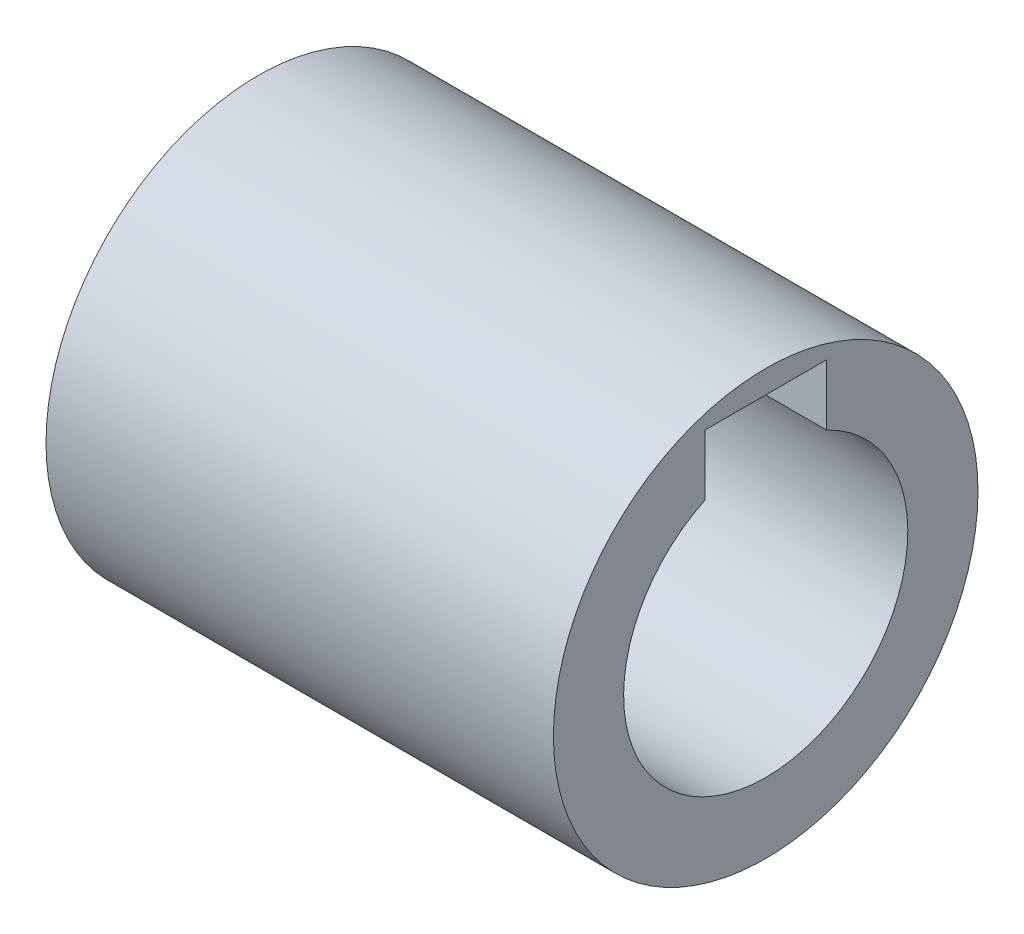
ISO-10303-21;
HEADER;
FILE_DESCRIPTION(('STEP AP214'),'2;1');
FILE_NAME('part.step','',(''),(''),'','','');
FILE_SCHEMA(('AUTOMOTIVE_DESIGN { 1 0 10303 214 1 1 1 1 }'));
ENDSEC;
DATA;
#1=APPLICATION_CONTEXT('core data for automotive mechanical design processes');
#2=APPLICATION_PROTOCOL_DEFINITION('international standard','automotive_design',2000,#1);
#3=PRODUCT_CONTEXT('',#1,'mechanical');
#4=PRODUCT('Part','Part','',(#3));
#5=PRODUCT_RELATED_PRODUCT_CATEGORY('part','',(#4));
#6=PRODUCT_DEFINITION_FORMATION('','',#4);
#7=PRODUCT_DEFINITION_CONTEXT('part definition',#1,'design');
#8=PRODUCT_DEFINITION('design','',#6,#7);
#9=PRODUCT_DEFINITION_SHAPE('','',#8);
#10=(LENGTH_UNIT() NAMED_UNIT(*) SI_UNIT(.MILLI.,.METRE.));
#11=(NAMED_UNIT(*) PLANE_ANGLE_UNIT() SI_UNIT($,.RADIAN.));
#12=(NAMED_UNIT(*) SI_UNIT($,.STERADIAN.) SOLID_ANGLE_UNIT());
#13=UNCERTAINTY_MEASURE_WITH_UNIT(LENGTH_MEASURE(1.E-05),#10,'distance_accuracy_value','');
#14=(GEOMETRIC_REPRESENTATION_CONTEXT(3) GLOBAL_UNCERTAINTY_ASSIGNED_CONTEXT((#13)) GLOBAL_UNIT_ASSIGNED_CONTEXT((#10,
#11,#12)) REPRESENTATION_CONTEXT('',''));
#15=CARTESIAN_POINT('',(0.,0.,0.));
#16=DIRECTION('',(0.,0.,1.));
#17=DIRECTION('',(1.,0.,0.));
#18=AXIS2_PLACEMENT_3D('',#15,#16,#17);
#19=CARTESIAN_POINT('',(12.5,0.,-1.5));
#20=DIRECTION('',(0.,0.,-1.));
#21=DIRECTION('',(0.,1.,0.));
#22=AXIS2_PLACEMENT_3D('',#19,#20,#21);
#23=PLANE('',#22);
#24=DIRECTION('',(0.,-1.,0.));
#25=VECTOR('',#24,1.);
#26=CARTESIAN_POINT('',(0.,0.,-1.5));
#27=LINE('',#26,#25);
#28=CARTESIAN_POINT('',(0.,4.66227766016838,-1.5));
#29=VERTEX_POINT('',#28);
#30=CARTESIAN_POINT('',(0.,3.16227766016838,-1.5));
#31=VERTEX_POINT('',#30);
#32=EDGE_CURVE('E99',#29,#31,#27,.T.);
#33=ORIENTED_EDGE('',*,*,#32,.T.);
#34=DIRECTION('',(-1.,0.,0.));
#35=VECTOR('',#34,1.);
#36=CARTESIAN_POINT('',(12.5,3.16227766016838,-1.5));
#37=LINE('',#36,#35);
#38=CARTESIAN_POINT('',(12.5,3.16227766016838,-1.5));
#39=VERTEX_POINT('',#38);
#40=EDGE_CURVE('E11',#39,#31,#37,.T.);
#41=ORIENTED_EDGE('',*,*,#40,.F.);
#42=DIRECTION('',(0.,-1.,0.));
#43=VECTOR('',#42,1.);
#44=CARTESIAN_POINT('',(12.5,0.,-1.5));
#45=LINE('',#44,#43);
#46=CARTESIAN_POINT('',(12.5,4.66227766016838,-1.5));
#47=VERTEX_POINT('',#46);
#48=EDGE_CURVE('E81',#47,#39,#45,.T.);
#49=ORIENTED_EDGE('',*,*,#48,.F.);
#50=DIRECTION('',(-1.,0.,0.));
#51=VECTOR('',#50,1.);
#52=CARTESIAN_POINT('',(12.5,4.66227766016838,-1.5));
#53=LINE('',#52,#51);
#54=EDGE_CURVE('E98',#47,#29,#53,.T.);
#55=ORIENTED_EDGE('',*,*,#54,.T.);
#56=EDGE_LOOP('',(#33,#41,#49,#55));
#57=FACE_BOUND('',#56,.T.);
#58=ADVANCED_FACE('F33',(#57),#23,.F.);
#59=CARTESIAN_POINT('',(12.5,0.,0.));
#60=DIRECTION('',(-1.,0.,0.));
#61=DIRECTION('',(0.,0.,1.));
#62=AXIS2_PLACEMENT_3D('',#59,#60,#61);
#63=CYLINDRICAL_SURFACE('',#62,3.5);
#64=CARTESIAN_POINT('',(0.,0.,0.));
#65=DIRECTION('',(1.,0.,0.));
#66=DIRECTION('',(0.,0.,-1.));
#67=AXIS2_PLACEMENT_3D('',#64,#65,#66);
#68=CIRCLE('',#67,3.5);
#69=CARTESIAN_POINT('',(0.,3.16227766016838,1.5));
#70=VERTEX_POINT('',#69);
#71=EDGE_CURVE('E86',#31,#70,#68,.F.);
#72=ORIENTED_EDGE('',*,*,#71,.T.);
#73=DIRECTION('',(-1.,0.,0.));
#74=VECTOR('',#73,1.);
#75=CARTESIAN_POINT('',(12.5,3.16227766016838,1.5));
#76=LINE('',#75,#74);
#77=CARTESIAN_POINT('',(12.5,3.16227766016838,1.5));
#78=VERTEX_POINT('',#77);
#79=EDGE_CURVE('E41',#78,#70,#76,.T.);
#80=ORIENTED_EDGE('',*,*,#79,.F.);
#81=CARTESIAN_POINT('',(12.5,0.,0.));
#82=DIRECTION('',(1.,0.,0.));
#83=DIRECTION('',(0.,0.,-1.));
#84=AXIS2_PLACEMENT_3D('',#81,#82,#83);
#85=CIRCLE('',#84,3.5);
#86=EDGE_CURVE('E75',#39,#78,#85,.F.);
#87=ORIENTED_EDGE('',*,*,#86,.F.);
#88=ORIENTED_EDGE('',*,*,#40,.T.);
#89=EDGE_LOOP('',(#72,#80,#87,#88));
#90=FACE_BOUND('',#89,.T.);
#91=ADVANCED_FACE('F85',(#90),#63,.F.);
#92=CARTESIAN_POINT('',(12.5,0.,1.5));
#93=DIRECTION('',(0.,0.,-1.));
#94=DIRECTION('',(0.,1.,0.));
#95=AXIS2_PLACEMENT_3D('',#92,#93,#94);
#96=PLANE('',#95);
#97=DIRECTION('',(0.,-1.,0.));
#98=VECTOR('',#97,1.);
#99=CARTESIAN_POINT('',(0.,0.,1.5));
#100=LINE('',#99,#98);
#101=CARTESIAN_POINT('',(0.,4.66227766016838,1.5));
#102=VERTEX_POINT('',#101);
#103=EDGE_CURVE('E103',#102,#70,#100,.T.);
#104=ORIENTED_EDGE('',*,*,#103,.F.);
#105=DIRECTION('',(-1.,0.,0.));
#106=VECTOR('',#105,1.);
#107=CARTESIAN_POINT('',(12.5,4.66227766016838,1.5));
#108=LINE('',#107,#106);
#109=CARTESIAN_POINT('',(12.5,4.66227766016838,1.5));
#110=VERTEX_POINT('',#109);
#111=EDGE_CURVE('E65',#110,#102,#108,.T.);
#112=ORIENTED_EDGE('',*,*,#111,.F.);
#113=DIRECTION('',(0.,-1.,0.));
#114=VECTOR('',#113,1.);
#115=CARTESIAN_POINT('',(12.5,0.,1.5));
#116=LINE('',#115,#114);
#117=EDGE_CURVE('E79',#110,#78,#116,.T.);
#118=ORIENTED_EDGE('',*,*,#117,.T.);
#119=ORIENTED_EDGE('',*,*,#79,.T.);
#120=EDGE_LOOP('',(#104,#112,#118,#119));
#121=FACE_BOUND('',#120,.T.);
#122=ADVANCED_FACE('F90',(#121),#96,.T.);
#123=CARTESIAN_POINT('',(12.5,4.66227766016838,0.));
#124=DIRECTION('',(0.,1.,0.));
#125=DIRECTION('',(0.,0.,1.));
#126=AXIS2_PLACEMENT_3D('',#123,#124,#125);
#127=PLANE('',#126);
#128=DIRECTION('',(0.,0.,-1.));
#129=VECTOR('',#128,1.);
#130=CARTESIAN_POINT('',(0.,4.66227766016838,0.));
#131=LINE('',#130,#129);
#132=EDGE_CURVE('E68',#102,#29,#131,.T.);
#133=ORIENTED_EDGE('',*,*,#132,.T.);
#134=ORIENTED_EDGE('',*,*,#54,.F.);
#135=DIRECTION('',(0.,0.,-1.));
#136=VECTOR('',#135,1.);
#137=CARTESIAN_POINT('',(12.5,4.66227766016838,0.));
#138=LINE('',#137,#136);
#139=EDGE_CURVE('E49',#110,#47,#138,.T.);
#140=ORIENTED_EDGE('',*,*,#139,.F.);
#141=ORIENTED_EDGE('',*,*,#111,.T.);
#142=EDGE_LOOP('',(#133,#134,#140,#141));
#143=FACE_BOUND('',#142,.T.);
#144=ADVANCED_FACE('F121',(#143),#127,.F.);
#145=CARTESIAN_POINT('',(12.5,0.,0.));
#146=DIRECTION('',(-1.,0.,0.));
#147=DIRECTION('',(0.,0.,1.));
#148=AXIS2_PLACEMENT_3D('',#145,#146,#147);
#149=CYLINDRICAL_SURFACE('',#148,5.22932306226828);
#150=CARTESIAN_POINT('',(12.5,0.,0.));
#151=DIRECTION('',(1.,0.,0.));
#152=DIRECTION('',(0.,0.,-1.));
#153=AXIS2_PLACEMENT_3D('',#150,#151,#152);
#154=CIRCLE('',#153,5.22932306226828);
#155=CARTESIAN_POINT('',(12.5,0.,-5.22932306226828));
#156=VERTEX_POINT('',#155);
#157=EDGE_CURVE('E92',#156,#156,#154,.T.);
#158=ORIENTED_EDGE('',*,*,#157,.F.);
#159=EDGE_LOOP('',(#158));
#160=FACE_BOUND('',#159,.T.);
#161=CARTESIAN_POINT('',(0.,0.,0.));
#162=DIRECTION('',(1.,0.,0.));
#163=DIRECTION('',(0.,0.,-1.));
#164=AXIS2_PLACEMENT_3D('',#161,#162,#163);
#165=CIRCLE('',#164,5.22932306226828);
#166=CARTESIAN_POINT('',(0.,0.,-5.22932306226828));
#167=VERTEX_POINT('',#166);
#168=EDGE_CURVE('E106',#167,#167,#165,.T.);
#169=ORIENTED_EDGE('',*,*,#168,.T.);
#170=EDGE_LOOP('',(#169));
#171=FACE_BOUND('',#170,.T.);
#172=ADVANCED_FACE('F119',(#160,#171),#149,.T.);
#173=CARTESIAN_POINT('',(12.5,0.,0.));
#174=DIRECTION('',(1.,0.,0.));
#175=DIRECTION('',(0.,0.,-1.));
#176=AXIS2_PLACEMENT_3D('',#173,#174,#175);
#177=PLANE('',#176);
#178=ORIENTED_EDGE('',*,*,#48,.T.);
#179=ORIENTED_EDGE('',*,*,#86,.T.);
#180=ORIENTED_EDGE('',*,*,#117,.F.);
#181=ORIENTED_EDGE('',*,*,#139,.T.);
#182=EDGE_LOOP('',(#178,#179,#180,#181));
#183=FACE_BOUND('',#182,.T.);
#184=ORIENTED_EDGE('',*,*,#157,.T.);
#185=EDGE_LOOP('',(#184));
#186=FACE_BOUND('',#185,.T.);
#187=ADVANCED_FACE('F76',(#183,#186),#177,.T.);
#188=CARTESIAN_POINT('',(0.,0.,0.));
#189=DIRECTION('',(1.,0.,0.));
#190=DIRECTION('',(0.,0.,-1.));
#191=AXIS2_PLACEMENT_3D('',#188,#189,#190);
#192=PLANE('',#191);
#193=ORIENTED_EDGE('',*,*,#32,.F.);
#194=ORIENTED_EDGE('',*,*,#132,.F.);
#195=ORIENTED_EDGE('',*,*,#103,.T.);
#196=ORIENTED_EDGE('',*,*,#71,.F.);
#197=EDGE_LOOP('',(#193,#194,#195,#196));
#198=FACE_BOUND('',#197,.T.);
#199=ORIENTED_EDGE('',*,*,#168,.F.);
#200=EDGE_LOOP('',(#199));
#201=FACE_BOUND('',#200,.T.);
#202=ADVANCED_FACE('F113',(#198,#201),#192,.F.);
#203=CLOSED_SHELL('',(#58,#91,#122,#144,#172,#187,#202));
#204=MANIFOLD_SOLID_BREP('B2',#203);
#205=ADVANCED_BREP_SHAPE_REPRESENTATION('',(#18,#204),#14);
#206=SHAPE_DEFINITION_REPRESENTATION(#9,#205);
ENDSEC;
END-ISO-10303-21;
